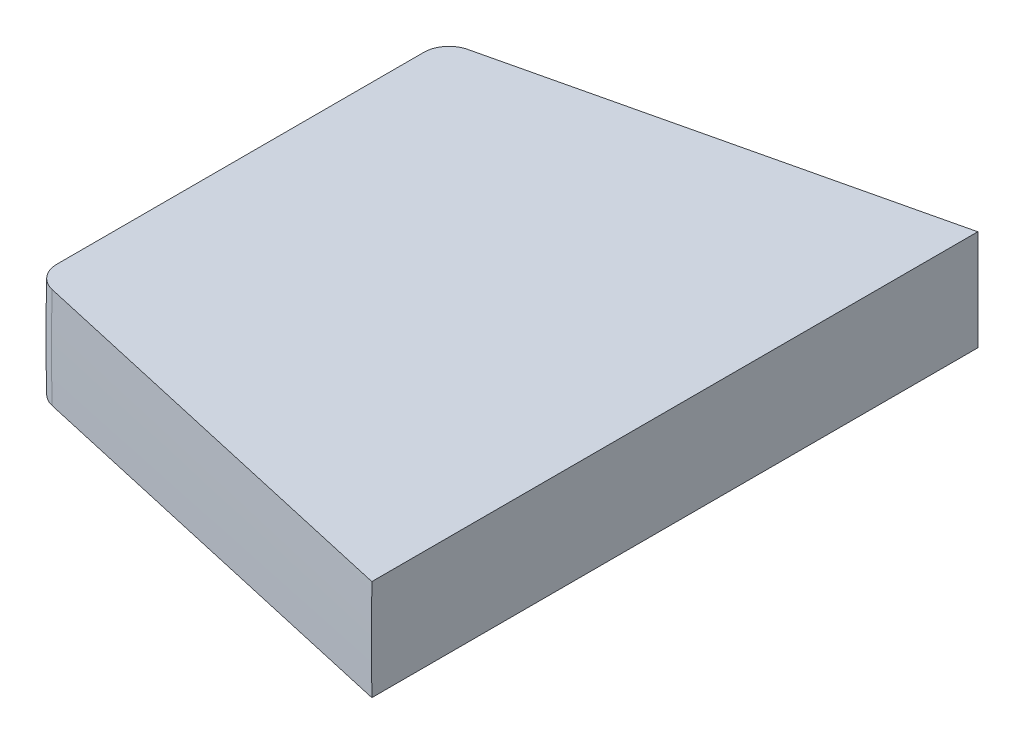
ISO-10303-21;
HEADER;
FILE_DESCRIPTION(('STEP AP214'),'2;1');
FILE_NAME('part.step','',(''),(''),'','','');
FILE_SCHEMA(('AUTOMOTIVE_DESIGN { 1 0 10303 214 1 1 1 1 }'));
ENDSEC;
DATA;
#1=APPLICATION_CONTEXT('core data for automotive mechanical design processes');
#2=APPLICATION_PROTOCOL_DEFINITION('international standard','automotive_design',2000,#1);
#3=PRODUCT_CONTEXT('',#1,'mechanical');
#4=PRODUCT('Part','Part','',(#3));
#5=PRODUCT_RELATED_PRODUCT_CATEGORY('part','',(#4));
#6=PRODUCT_DEFINITION_FORMATION('','',#4);
#7=PRODUCT_DEFINITION_CONTEXT('part definition',#1,'design');
#8=PRODUCT_DEFINITION('design','',#6,#7);
#9=PRODUCT_DEFINITION_SHAPE('','',#8);
#10=(LENGTH_UNIT() NAMED_UNIT(*) SI_UNIT(.MILLI.,.METRE.));
#11=(NAMED_UNIT(*) PLANE_ANGLE_UNIT() SI_UNIT($,.RADIAN.));
#12=(NAMED_UNIT(*) SI_UNIT($,.STERADIAN.) SOLID_ANGLE_UNIT());
#13=UNCERTAINTY_MEASURE_WITH_UNIT(LENGTH_MEASURE(1.E-05),#10,'distance_accuracy_value','');
#14=(GEOMETRIC_REPRESENTATION_CONTEXT(3) GLOBAL_UNCERTAINTY_ASSIGNED_CONTEXT((#13)) GLOBAL_UNIT_ASSIGNED_CONTEXT((#10,
#11,#12)) REPRESENTATION_CONTEXT('',''));
#15=CARTESIAN_POINT('',(0.,0.,0.));
#16=DIRECTION('',(0.,0.,1.));
#17=DIRECTION('',(1.,0.,0.));
#18=AXIS2_PLACEMENT_3D('',#15,#16,#17);
#19=CARTESIAN_POINT('',(-5.25274268525777E-12,7.08417699502029E-13,4.77559832415817));
#20=DIRECTION('',(0.,0.,-1.));
#21=DIRECTION('',(-1.,0.,0.));
#22=AXIS2_PLACEMENT_3D('',#19,#20,#21);
#23=TOROIDAL_SURFACE('',#22,33.114657467372,0.499999999999997);
#24=CARTESIAN_POINT('',(-33.2141183960311,-1.00000001489884,4.28888778514573));
#25=CARTESIAN_POINT('',(-33.2415169656083,-1.00000001489884,4.29530658537068));
#26=CARTESIAN_POINT('',(-33.2683547903981,-1.00000001489884,4.30407949669645));
#27=CARTESIAN_POINT('',(-33.3201764680412,-1.00000001489884,4.32598278264256));
#28=CARTESIAN_POINT('',(-33.3451611258211,-1.00000001489884,4.33911125169522));
#29=CARTESIAN_POINT('',(-33.3925792373398,-1.00000001489884,4.36938752437649));
#30=CARTESIAN_POINT('',(-33.4150116051159,-1.00000001489884,4.38653702946993));
#31=CARTESIAN_POINT('',(-33.4566700215579,-1.00000001489884,4.42435178343596));
#32=CARTESIAN_POINT('',(-33.4758972906982,-1.00000001489884,4.44501568797173));
#33=CARTESIAN_POINT('',(-33.5106030531232,-1.00000001489884,4.48927327807427));
#34=CARTESIAN_POINT('',(-33.5260825643279,-1.00000001489884,4.51286616546715));
#35=CARTESIAN_POINT('',(-33.5528659062368,-1.00000001489884,4.56232539641721));
#36=CARTESIAN_POINT('',(-33.5641683289772,-1.00000001489884,4.58819250291121));
#37=CARTESIAN_POINT('',(-33.5819881713164,-1.00000001489884,4.64065342290163));
#38=CARTESIAN_POINT('',(-33.588639446958,-1.00000001489884,4.66720188906133));
#39=CARTESIAN_POINT('',(-33.5975460161339,-1.00000001489884,4.72103042549659));
#40=CARTESIAN_POINT('',(-33.5998004886834,-1.00000001489884,4.74831063144104));
#41=CARTESIAN_POINT('',(-33.5997797108746,-1.00000001489884,4.77559832415817));
#42=B_SPLINE_CURVE_WITH_KNOTS('',3,(#24,#25,#26,#27,#28,#29,#30,#31,#32,#33,#34,#35,#36,#37,#38,
#39,#40,#41),.UNSPECIFIED.,.F.,.F.,(4,2,2,2,2,2,2,2,4),(0.,0.0843094697697567,0.16858210246519,
0.25289045891751,0.337166637765026,0.42141990080922,0.505701537106041,0.587444908923043,
0.66920354265875),.UNSPECIFIED.);
#43=CARTESIAN_POINT('',(-33.2141183960311,-1.00000001489884,4.28888778514573));
#44=VERTEX_POINT('',#43);
#45=CARTESIAN_POINT('',(-33.5997797108746,-1.00000001489884,4.77559832415817));
#46=VERTEX_POINT('',#45);
#47=EDGE_CURVE('E82',#44,#46,#42,.T.);
#48=ORIENTED_EDGE('',*,*,#47,.T.);
#49=CARTESIAN_POINT('',(6.39037434080336E-11,6.89444161483532E-13,4.77559832415719));
#50=DIRECTION('',(0.,0.,1.));
#51=DIRECTION('',(1.,0.,0.));
#52=AXIS2_PLACEMENT_3D('',#49,#50,#51);
#53=CIRCLE('',#52,33.6146574674411);
#54=CARTESIAN_POINT('',(-33.5997797108745,1.00000001490116,4.77559832415817));
#55=VERTEX_POINT('',#54);
#56=EDGE_CURVE('E80',#55,#46,#53,.T.);
#57=ORIENTED_EDGE('',*,*,#56,.F.);
#58=CARTESIAN_POINT('',(-33.5997797108746,1.00000001490116,4.77559832415817));
#59=CARTESIAN_POINT('',(-33.5998036460459,1.00000001490116,4.7474829254751));
#60=CARTESIAN_POINT('',(-33.597408668477,1.00000001490116,4.7193746938985));
#61=CARTESIAN_POINT('',(-33.5879559879131,1.00000001490116,4.66396589654604));
#62=CARTESIAN_POINT('',(-33.5809004598779,1.00000001490116,4.63666496023214));
#63=CARTESIAN_POINT('',(-33.5622976478805,1.00000001490116,4.58362548857816));
#64=CARTESIAN_POINT('',(-33.5507485154428,1.00000001490116,4.55788760125276));
#65=CARTESIAN_POINT('',(-33.5234998995368,1.00000001490116,4.50872473369079));
#66=CARTESIAN_POINT('',(-33.5078019721403,1.00000001490116,4.48529889079994));
#67=CARTESIAN_POINT('',(-33.4726941221774,1.00000001490116,4.44140918693668));
#68=CARTESIAN_POINT('',(-33.453283421856,1.00000001490116,4.42094594815412));
#69=CARTESIAN_POINT('',(-33.4112963716063,1.00000001490116,4.3835581913007));
#70=CARTESIAN_POINT('',(-33.3887189211882,1.00000001490116,4.36663490852917));
#71=CARTESIAN_POINT('',(-33.3416986073237,1.00000001490116,4.33723164337082));
#72=CARTESIAN_POINT('',(-33.3173238322121,1.00000001490116,4.32464259067658));
#73=CARTESIAN_POINT('',(-33.2668489335209,1.00000001490116,4.30359086555293));
#74=CARTESIAN_POINT('',(-33.2407485014051,1.00000001490116,4.29512893330347));
#75=CARTESIAN_POINT('',(-33.214118396031,1.00000001490116,4.28888778514571));
#76=B_SPLINE_CURVE_WITH_KNOTS('',3,(#58,#59,#60,#61,#62,#63,#64,#65,#66,#67,#68,#69,#70,#71,#72,
#73,#74,#75),.UNSPECIFIED.,.F.,.F.,(4,2,2,2,2,2,2,2,4),(0.,0.0842341211088909,0.168428960051868,
0.252658469807501,0.33685643266179,0.421072052738538,0.505317011763199,0.587252959202659,
0.669203596076549),.UNSPECIFIED.);
#77=CARTESIAN_POINT('',(-33.214118396031,1.00000001490116,4.28888778514572));
#78=VERTEX_POINT('',#77);
#79=EDGE_CURVE('E21',#55,#78,#76,.T.);
#80=ORIENTED_EDGE('',*,*,#79,.T.);
#81=CARTESIAN_POINT('',(-2.87825319134072E-11,1.80129348936742E-12,4.28888778514627));
#82=DIRECTION('',(0.,0.,-1.));
#83=DIRECTION('',(-1.,0.,0.));
#84=AXIS2_PLACEMENT_3D('',#81,#82,#83);
#85=CIRCLE('',#84,33.2291688257991);
#86=EDGE_CURVE('E77',#44,#78,#85,.T.);
#87=ORIENTED_EDGE('',*,*,#86,.F.);
#88=EDGE_LOOP('',(#48,#57,#80,#87));
#89=FACE_BOUND('',#88,.T.);
#90=ADVANCED_FACE('F16',(#89),#23,.T.);
#91=CARTESIAN_POINT('',(6.39037434080336E-11,6.89444161483532E-13,4.77559832415719));
#92=DIRECTION('',(0.,0.,1.));
#93=DIRECTION('',(1.,0.,0.));
#94=AXIS2_PLACEMENT_3D('',#91,#92,#93);
#95=CYLINDRICAL_SURFACE('',#94,33.6146574674411);
#96=DIRECTION('',(0.,0.,-1.));
#97=VECTOR('',#96,1.);
#98=CARTESIAN_POINT('',(-33.5997797108746,-1.00000001489884,8.3835522392875));
#99=LINE('',#98,#97);
#100=CARTESIAN_POINT('',(-33.5997797108746,-1.00000001489884,12.070682298208));
#101=VERTEX_POINT('',#100);
#102=EDGE_CURVE('E129',#101,#46,#99,.T.);
#103=ORIENTED_EDGE('',*,*,#102,.F.);
#104=CARTESIAN_POINT('',(9.92955717649124E-12,7.38341679462629E-13,12.070682298208));
#105=DIRECTION('',(0.,0.,1.));
#106=DIRECTION('',(1.,0.,0.));
#107=AXIS2_PLACEMENT_3D('',#104,#105,#106);
#108=CIRCLE('',#107,33.6146574673871);
#109=CARTESIAN_POINT('',(-33.5997797108745,1.00000001490116,12.070682298208));
#110=VERTEX_POINT('',#109);
#111=EDGE_CURVE('E166',#110,#101,#108,.T.);
#112=ORIENTED_EDGE('',*,*,#111,.F.);
#113=DIRECTION('',(0.,0.,1.));
#114=VECTOR('',#113,1.);
#115=CARTESIAN_POINT('',(-33.5997797108745,1.00000001490116,8.38355223928751));
#116=LINE('',#115,#114);
#117=EDGE_CURVE('E94',#55,#110,#116,.T.);
#118=ORIENTED_EDGE('',*,*,#117,.F.);
#119=ORIENTED_EDGE('',*,*,#56,.T.);
#120=EDGE_LOOP('',(#103,#112,#118,#119));
#121=FACE_BOUND('',#120,.T.);
#122=ADVANCED_FACE('F116',(#121),#95,.T.);
#123=CARTESIAN_POINT('',(1.04239533671446E-11,1.07357699119515E-12,2.35119072018135));
#124=DIRECTION('',(0.,0.,1.));
#125=DIRECTION('',(1.,0.,0.));
#126=AXIS2_PLACEMENT_3D('',#123,#124,#125);
#127=CONICAL_SURFACE('',#126,24.9933257121797,1.33972273017406);
#128=CARTESIAN_POINT('',(-33.2141183960311,-1.00000001489884,4.28888778514574));
#129=CARTESIAN_POINT('',(-31.8451108988771,-1.00000001489884,3.96693217403374));
#130=CARTESIAN_POINT('',(-30.4760973150438,-1.00000001489884,3.6450024488623));
#131=CARTESIAN_POINT('',(-27.7380579738807,-1.00000001489884,3.00119477036808));
#132=CARTESIAN_POINT('',(-26.3690322165509,-1.00000001489884,2.67931681704531));
#133=CARTESIAN_POINT('',(-25.0000003725418,-1.00000001489884,2.3574647496631));
#134=B_SPLINE_CURVE_WITH_KNOTS('',3,(#128,#129,#130,#131,#132,#133),.UNSPECIFIED.,.F.,.F.,(4,2,
4),(0.,4.21906772474934,8.43813544992386),.UNSPECIFIED.);
#135=CARTESIAN_POINT('',(-25.0000003725418,-1.00000001489884,2.3574647496631));
#136=VERTEX_POINT('',#135);
#137=EDGE_CURVE('E88',#44,#136,#134,.T.);
#138=ORIENTED_EDGE('',*,*,#137,.F.);
#139=ORIENTED_EDGE('',*,*,#86,.T.);
#140=CARTESIAN_POINT('',(-25.0000003725418,1.00000001490116,2.3574647496631));
#141=CARTESIAN_POINT('',(-26.3690322165508,1.00000001490116,2.67931681704531));
#142=CARTESIAN_POINT('',(-27.7380579738806,1.00000001490116,3.00119477036808));
#143=CARTESIAN_POINT('',(-30.4760973150437,1.00000001490116,3.64500244886228));
#144=CARTESIAN_POINT('',(-31.845110898877,1.00000001490116,3.96693217403372));
#145=CARTESIAN_POINT('',(-33.214118396031,1.00000001490116,4.28888778514571));
#146=B_SPLINE_CURVE_WITH_KNOTS('',3,(#140,#141,#142,#143,#144,#145),.UNSPECIFIED.,.F.,.F.,(4,2,
4),(0.,4.21906772517447,8.43813544992376),.UNSPECIFIED.);
#147=CARTESIAN_POINT('',(-25.0000003725418,1.00000001490116,2.3574647496631));
#148=VERTEX_POINT('',#147);
#149=EDGE_CURVE('E86',#148,#78,#146,.T.);
#150=ORIENTED_EDGE('',*,*,#149,.F.);
#151=CARTESIAN_POINT('',(-25.0000003725418,-1.00000001489884,2.3574647496631));
#152=CARTESIAN_POINT('',(-25.0000003725418,-0.666666676598837,2.35432898872528));
#153=CARTESIAN_POINT('',(-25.0000003725418,-0.333333338298837,2.35276110825637));
#154=CARTESIAN_POINT('',(-25.0000003725418,0.333333338301163,2.35276110825637));
#155=CARTESIAN_POINT('',(-25.0000003725418,0.666666676601163,2.35432898872528));
#156=CARTESIAN_POINT('',(-25.0000003725418,1.00000001490116,2.3574647496631));
#157=B_SPLINE_CURVE_WITH_KNOTS('',3,(#151,#152,#153,#154,#155,#156),.UNSPECIFIED.,.F.,.F.,(4,2,
4),(0.,1.00001107695989,2.00002215391978),.UNSPECIFIED.);
#158=EDGE_CURVE('E120',#136,#148,#157,.T.);
#159=ORIENTED_EDGE('',*,*,#158,.F.);
#160=EDGE_LOOP('',(#138,#139,#150,#159));
#161=FACE_BOUND('',#160,.T.);
#162=ADVANCED_FACE('F84',(#161),#127,.T.);
#163=CARTESIAN_POINT('',(-33.6097797108745,1.00000001490116,14.4196397289119));
#164=DIRECTION('',(0.,1.,0.));
#165=DIRECTION('',(1.,0.,0.));
#166=AXIS2_PLACEMENT_3D('',#163,#164,#165);
#167=PLANE('',#166);
#168=ORIENTED_EDGE('',*,*,#117,.T.);
#169=CARTESIAN_POINT('',(-33.2096529344975,1.00000001490116,12.5584214245498));
#170=CARTESIAN_POINT('',(-33.2371092020699,1.00000001490116,12.5522537619499));
#171=CARTESIAN_POINT('',(-33.264026304747,1.00000001490116,12.5437269633244));
#172=CARTESIAN_POINT('',(-33.3160469141865,1.00000001490116,12.5222989647473));
#173=CARTESIAN_POINT('',(-33.3411511817215,1.00000001490116,12.5093996128712));
#174=CARTESIAN_POINT('',(-33.3888453834416,1.00000001490116,12.4795582619923));
#175=CARTESIAN_POINT('',(-33.4114342451954,1.00000001490116,12.4626145482993));
#176=CARTESIAN_POINT('',(-33.4534375451766,1.00000001490116,12.4251824540357));
#177=CARTESIAN_POINT('',(-33.4728532444857,1.00000001490116,12.4046954883235));
#178=CARTESIAN_POINT('',(-33.5079626293777,1.00000001490116,12.360757705808));
#179=CARTESIAN_POINT('',(-33.5236573794789,1.00000001490116,12.3373077396333));
#180=CARTESIAN_POINT('',(-33.550893053783,1.00000001490116,12.28809582491));
#181=CARTESIAN_POINT('',(-33.562432367737,1.00000001490116,12.2623329849337));
#182=CARTESIAN_POINT('',(-33.5809823955278,1.00000001490116,12.20931961438));
#183=CARTESIAN_POINT('',(-33.5880075548878,1.00000001490116,12.1820741350029));
#184=CARTESIAN_POINT('',(-33.5974190415515,1.00000001490116,12.1267825011437));
#185=CARTESIAN_POINT('',(-33.5998033858346,1.00000001490116,12.0987360095806));
#186=CARTESIAN_POINT('',(-33.5997797108745,1.00000001490116,12.070682298208));
#187=B_SPLINE_CURVE_WITH_KNOTS('',3,(#169,#170,#171,#172,#173,#174,#175,#176,#177,#178,#179,
#180,#181,#182,#183,#184,#185,#186),.UNSPECIFIED.,.F.,.F.,(4,2,2,2,2,2,2,2,4),(0.,
0.0843096839848734,0.168583778514139,0.252893666437164,0.337169965920451,0.421422125804902,
0.505706898712499,0.589720594904712,0.67377018228148),.UNSPECIFIED.);
#188=CARTESIAN_POINT('',(-33.2096529344976,1.00000001490116,12.5584214245498));
#189=VERTEX_POINT('',#188);
#190=EDGE_CURVE('E96',#189,#110,#187,.T.);
#191=ORIENTED_EDGE('',*,*,#190,.F.);
#192=CARTESIAN_POINT('',(-25.0000003725418,1.00000001490116,14.4096397289119));
#193=CARTESIAN_POINT('',(-26.3682870325563,1.00000001490116,14.1011531599683));
#194=CARTESIAN_POINT('',(-27.7365680760918,1.00000001490116,13.7926416834592));
#195=CARTESIAN_POINT('',(-30.4731189300771,1.00000001490116,13.1755689153385));
#196=CARTESIAN_POINT('',(-31.8413887405268,1.00000001490116,12.867007623727));
#197=CARTESIAN_POINT('',(-33.2096529344975,1.00000001490116,12.5584214245498));
#198=B_SPLINE_CURVE_WITH_KNOTS('',3,(#192,#193,#194,#195,#196,#197),.UNSPECIFIED.,.F.,.F.,(4,2,
4),(0.,4.20789152749073,8.41578305458861),.UNSPECIFIED.);
#199=CARTESIAN_POINT('',(-25.0000003725418,1.00000001490116,14.4096397289119));
#200=VERTEX_POINT('',#199);
#201=EDGE_CURVE('E152',#200,#189,#198,.T.);
#202=ORIENTED_EDGE('',*,*,#201,.F.);
#203=DIRECTION('',(0.,0.,1.));
#204=VECTOR('',#203,1.);
#205=CARTESIAN_POINT('',(-25.0000003725418,1.00000001490116,8.38335944438054));
#206=LINE('',#205,#204);
#207=EDGE_CURVE('E92',#148,#200,#206,.T.);
#208=ORIENTED_EDGE('',*,*,#207,.F.);
#209=ORIENTED_EDGE('',*,*,#149,.T.);
#210=ORIENTED_EDGE('',*,*,#79,.F.);
#211=EDGE_LOOP('',(#168,#191,#202,#208,#209,#210));
#212=FACE_BOUND('',#211,.T.);
#213=ADVANCED_FACE('F90',(#212),#167,.T.);
#214=CARTESIAN_POINT('',(9.92955717649124E-12,7.38341679462629E-13,12.070682298208));
#215=DIRECTION('',(0.,0.,-1.));
#216=DIRECTION('',(-1.,0.,0.));
#217=AXIS2_PLACEMENT_3D('',#214,#215,#216);
#218=TOROIDAL_SURFACE('',#217,33.1146574673872,0.499999999999971);
#219=CARTESIAN_POINT('',(-33.2096529344976,-1.00000001489884,12.5584214245498));
#220=CARTESIAN_POINT('',(-33.23710920207,-1.00000001489884,12.5522537619499));
#221=CARTESIAN_POINT('',(-33.2640263047471,-1.00000001489884,12.5437269633244));
#222=CARTESIAN_POINT('',(-33.3160469141866,-1.00000001489884,12.5222989647473));
#223=CARTESIAN_POINT('',(-33.3411511817216,-1.00000001489884,12.5093996128711));
#224=CARTESIAN_POINT('',(-33.3888453834417,-1.00000001489884,12.4795582619922));
#225=CARTESIAN_POINT('',(-33.4114342451955,-1.00000001489884,12.4626145482992));
#226=CARTESIAN_POINT('',(-33.4534375451767,-1.00000001489884,12.4251824540356));
#227=CARTESIAN_POINT('',(-33.4728532444858,-1.00000001489884,12.4046954883235));
#228=CARTESIAN_POINT('',(-33.5079626293778,-1.00000001489884,12.360757705808));
#229=CARTESIAN_POINT('',(-33.5236573794789,-1.00000001489884,12.3373077396332));
#230=CARTESIAN_POINT('',(-33.5508930537831,-1.00000001489884,12.2880958249099));
#231=CARTESIAN_POINT('',(-33.5624323677371,-1.00000001489884,12.2623329849336));
#232=CARTESIAN_POINT('',(-33.5809823955279,-1.00000001489884,12.2093196143799));
#233=CARTESIAN_POINT('',(-33.5880075548879,-1.00000001489884,12.1820741350028));
#234=CARTESIAN_POINT('',(-33.5974190415516,-1.00000001489884,12.1267825011437));
#235=CARTESIAN_POINT('',(-33.5998033858347,-1.00000001489884,12.0987360095806));
#236=CARTESIAN_POINT('',(-33.5997797108746,-1.00000001489884,12.070682298208));
#237=B_SPLINE_CURVE_WITH_KNOTS('',3,(#219,#220,#221,#222,#223,#224,#225,#226,#227,#228,#229,
#230,#231,#232,#233,#234,#235,#236),.UNSPECIFIED.,.F.,.F.,(4,2,2,2,2,2,2,2,4),(0.,
0.084309683984872,0.168583778514138,0.252893666437174,0.337169965920436,0.421422125804896,
0.505706898712495,0.589720594904664,0.673770182281381),.UNSPECIFIED.);
#238=CARTESIAN_POINT('',(-33.2096529344976,-1.00000001489884,12.5584214245498));
#239=VERTEX_POINT('',#238);
#240=EDGE_CURVE('E130',#239,#101,#237,.T.);
#241=ORIENTED_EDGE('',*,*,#240,.F.);
#242=CARTESIAN_POINT('',(-4.64212002171394E-12,5.88830199876877E-13,12.5584214245509));
#243=DIRECTION('',(0.,0.,1.));
#244=DIRECTION('',(1.,0.,0.));
#245=AXIS2_PLACEMENT_3D('',#242,#243,#244);
#246=CIRCLE('',#245,33.2247053870953);
#247=EDGE_CURVE('E149',#189,#239,#246,.T.);
#248=ORIENTED_EDGE('',*,*,#247,.F.);
#249=ORIENTED_EDGE('',*,*,#190,.T.);
#250=ORIENTED_EDGE('',*,*,#111,.T.);
#251=EDGE_LOOP('',(#241,#248,#249,#250));
#252=FACE_BOUND('',#251,.T.);
#253=ADVANCED_FACE('F138',(#252),#218,.T.);
#254=CARTESIAN_POINT('',(-24.9900003725418,-1.00000001489884,14.4196397289119));
#255=DIRECTION('',(0.,-1.,0.));
#256=DIRECTION('',(-1.,0.,0.));
#257=AXIS2_PLACEMENT_3D('',#254,#255,#256);
#258=PLANE('',#257);
#259=ORIENTED_EDGE('',*,*,#137,.T.);
#260=DIRECTION('',(0.,0.,-1.));
#261=VECTOR('',#260,1.);
#262=CARTESIAN_POINT('',(-25.0000003725418,-1.00000001489884,8.38335944438055));
#263=LINE('',#262,#261);
#264=CARTESIAN_POINT('',(-25.0000003725418,-1.00000001489884,14.4096397289119));
#265=VERTEX_POINT('',#264);
#266=EDGE_CURVE('E41',#265,#136,#263,.T.);
#267=ORIENTED_EDGE('',*,*,#266,.F.);
#268=CARTESIAN_POINT('',(-33.2096529344976,-1.00000001489884,12.5584214245498));
#269=CARTESIAN_POINT('',(-31.8413887405269,-1.00000001489884,12.867007623727));
#270=CARTESIAN_POINT('',(-30.4731189300771,-1.00000001489884,13.1755689153385));
#271=CARTESIAN_POINT('',(-27.7365680760919,-1.00000001489884,13.7926416834592));
#272=CARTESIAN_POINT('',(-26.3682870325563,-1.00000001489884,14.1011531599684));
#273=CARTESIAN_POINT('',(-25.0000003725418,-1.00000001489884,14.4096397289119));
#274=B_SPLINE_CURVE_WITH_KNOTS('',3,(#268,#269,#270,#271,#272,#273),.UNSPECIFIED.,.F.,.F.,(4,2,
4),(0.,4.20789152709795,8.41578305458874),.UNSPECIFIED.);
#275=EDGE_CURVE('E32',#239,#265,#274,.T.);
#276=ORIENTED_EDGE('',*,*,#275,.F.);
#277=ORIENTED_EDGE('',*,*,#240,.T.);
#278=ORIENTED_EDGE('',*,*,#102,.T.);
#279=ORIENTED_EDGE('',*,*,#47,.F.);
#280=EDGE_LOOP('',(#259,#267,#276,#277,#278,#279));
#281=FACE_BOUND('',#280,.T.);
#282=ADVANCED_FACE('F134',(#281),#258,.T.);
#283=CARTESIAN_POINT('',(-25.0000003725418,1.01000001490116,2.33806122525328));
#284=DIRECTION('',(1.,0.,0.));
#285=DIRECTION('',(0.,0.,1.));
#286=AXIS2_PLACEMENT_3D('',#283,#284,#285);
#287=PLANE('',#286);
#288=ORIENTED_EDGE('',*,*,#158,.T.);
#289=ORIENTED_EDGE('',*,*,#207,.T.);
#290=CARTESIAN_POINT('',(-25.0000003725418,-1.00000001489884,14.4096397289119));
#291=CARTESIAN_POINT('',(-25.0000002982197,-0.91665199950816,14.4103913833345));
#292=CARTESIAN_POINT('',(-25.0000001173391,-0.833303137556075,14.411049228553));
#293=CARTESIAN_POINT('',(-24.9999998143107,-0.666626808428723,14.4121769227962));
#294=CARTESIAN_POINT('',(-24.9999996921469,-0.583299341598984,14.4126468228949));
#295=CARTESIAN_POINT('',(-24.9999997780624,-0.416649170719691,14.4133986328316));
#296=CARTESIAN_POINT('',(-24.9999999861195,-0.333326466727246,14.413680555326));
#297=CARTESIAN_POINT('',(-25.0000004768132,-0.166669175195207,14.4140564573648));
#298=CARTESIAN_POINT('',(-25.0000007594601,-0.0833345875973121,14.4141504110555));
#299=CARTESIAN_POINT('',(-25.0000007594601,0.0833345875985664,14.4141504110555));
#300=CARTESIAN_POINT('',(-25.0000004768133,0.16666917519655,14.4140564573648));
#301=CARTESIAN_POINT('',(-24.9999999861195,0.333326466728766,14.413680555326));
#302=CARTESIAN_POINT('',(-24.9999997780624,0.416649170721301,14.4133986328316));
#303=CARTESIAN_POINT('',(-24.9999996921469,0.583299341600787,14.4126468228949));
#304=CARTESIAN_POINT('',(-24.9999998143107,0.666626808430629,14.4121769227962));
#305=CARTESIAN_POINT('',(-25.0000001173391,0.833303137558189,14.411049228553));
#306=CARTESIAN_POINT('',(-25.0000002982197,0.916651999510378,14.4103913833345));
#307=CARTESIAN_POINT('',(-25.0000003725418,1.00000001490116,14.4096397289119));
#308=B_SPLINE_CURVE_WITH_KNOTS('',3,(#290,#291,#292,#293,#294,#295,#296,#297,#298,#299,#300,
#301,#302,#303,#304,#305,#306,#307),.UNSPECIFIED.,.F.,.F.,(4,2,2,2,2,2,2,2,4),(0.,
0.250054161934161,0.500040325568106,0.750009656246204,1.00001336599275,1.25001707573956,
1.49998640641792,1.74997257005218,2.00002673198665),.UNSPECIFIED.);
#309=EDGE_CURVE('E10',#265,#200,#308,.T.);
#310=ORIENTED_EDGE('',*,*,#309,.F.);
#311=ORIENTED_EDGE('',*,*,#266,.T.);
#312=EDGE_LOOP('',(#288,#289,#310,#311));
#313=FACE_BOUND('',#312,.T.);
#314=ADVANCED_FACE('F137',(#313),#287,.T.);
#315=CARTESIAN_POINT('',(-4.64212002171394E-12,5.88830199876877E-13,12.5584214245509));
#316=DIRECTION('',(0.,0.,-1.));
#317=DIRECTION('',(-1.,0.,0.));
#318=AXIS2_PLACEMENT_3D('',#315,#316,#317);
#319=CONICAL_SURFACE('',#318,33.2247053870953,1.34888360871233);
#320=ORIENTED_EDGE('',*,*,#275,.T.);
#321=ORIENTED_EDGE('',*,*,#309,.T.);
#322=ORIENTED_EDGE('',*,*,#201,.T.);
#323=ORIENTED_EDGE('',*,*,#247,.T.);
#324=EDGE_LOOP('',(#320,#321,#322,#323));
#325=FACE_BOUND('',#324,.T.);
#326=ADVANCED_FACE('F18',(#325),#319,.T.);
#327=CLOSED_SHELL('',(#90,#122,#162,#213,#253,#282,#314,#326));
#328=MANIFOLD_SOLID_BREP('B1',#327);
#329=ADVANCED_BREP_SHAPE_REPRESENTATION('',(#18,#328),#14);
#330=SHAPE_DEFINITION_REPRESENTATION(#9,#329);
ENDSEC;
END-ISO-10303-21;
